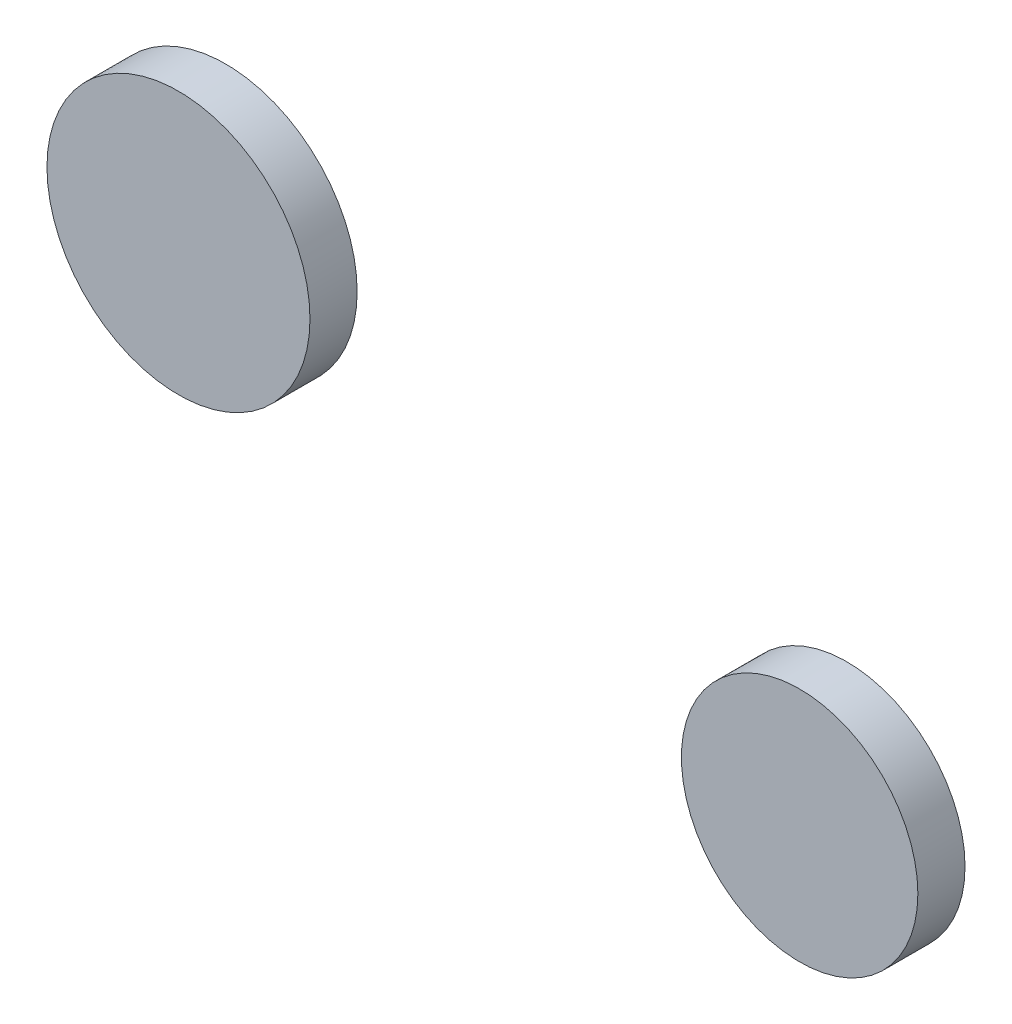
ISO-10303-21;
HEADER;
FILE_DESCRIPTION(('STEP AP214'),'2;1');
FILE_NAME('part.step','',(''),(''),'','','');
FILE_SCHEMA(('AUTOMOTIVE_DESIGN { 1 0 10303 214 1 1 1 1 }'));
ENDSEC;
DATA;
#1=APPLICATION_CONTEXT('core data for automotive mechanical design processes');
#2=APPLICATION_PROTOCOL_DEFINITION('international standard','automotive_design',2000,#1);
#3=PRODUCT_CONTEXT('',#1,'mechanical');
#4=PRODUCT('Part','Part','',(#3));
#5=PRODUCT_RELATED_PRODUCT_CATEGORY('part','',(#4));
#6=PRODUCT_DEFINITION_FORMATION('','',#4);
#7=PRODUCT_DEFINITION_CONTEXT('part definition',#1,'design');
#8=PRODUCT_DEFINITION('design','',#6,#7);
#9=PRODUCT_DEFINITION_SHAPE('','',#8);
#10=(LENGTH_UNIT() NAMED_UNIT(*) SI_UNIT(.MILLI.,.METRE.));
#11=(NAMED_UNIT(*) PLANE_ANGLE_UNIT() SI_UNIT($,.RADIAN.));
#12=(NAMED_UNIT(*) SI_UNIT($,.STERADIAN.) SOLID_ANGLE_UNIT());
#13=UNCERTAINTY_MEASURE_WITH_UNIT(LENGTH_MEASURE(1.E-05),#10,'distance_accuracy_value','');
#14=(GEOMETRIC_REPRESENTATION_CONTEXT(3) GLOBAL_UNCERTAINTY_ASSIGNED_CONTEXT((#13)) GLOBAL_UNIT_ASSIGNED_CONTEXT((#10,
#11,#12)) REPRESENTATION_CONTEXT('',''));
#15=CARTESIAN_POINT('',(0.,0.,0.));
#16=DIRECTION('',(0.,0.,1.));
#17=DIRECTION('',(1.,0.,0.));
#18=AXIS2_PLACEMENT_3D('',#15,#16,#17);
#19=CARTESIAN_POINT('',(-186.065711787609,51.9488183115893,10.));
#20=DIRECTION('',(0.,0.,-1.));
#21=DIRECTION('',(-1.,0.,0.));
#22=AXIS2_PLACEMENT_3D('',#19,#20,#21);
#23=CYLINDRICAL_SURFACE('',#22,27.8829526217616);
#24=CARTESIAN_POINT('',(-186.065711787609,51.9488183115893,10.));
#25=DIRECTION('',(0.,0.,1.));
#26=DIRECTION('',(1.,0.,0.));
#27=AXIS2_PLACEMENT_3D('',#24,#25,#26);
#28=CIRCLE('',#27,27.8829526217616);
#29=CARTESIAN_POINT('',(-158.182759165848,51.9488183115893,10.));
#30=VERTEX_POINT('',#29);
#31=EDGE_CURVE('E11',#30,#30,#28,.T.);
#32=ORIENTED_EDGE('',*,*,#31,.F.);
#33=EDGE_LOOP('',(#32));
#34=FACE_BOUND('',#33,.T.);
#35=CARTESIAN_POINT('',(-186.065711787609,51.9488183115893,0.));
#36=DIRECTION('',(0.,0.,1.));
#37=DIRECTION('',(1.,0.,0.));
#38=AXIS2_PLACEMENT_3D('',#35,#36,#37);
#39=CIRCLE('',#38,27.8829526217616);
#40=CARTESIAN_POINT('',(-158.182759165848,51.9488183115893,0.));
#41=VERTEX_POINT('',#40);
#42=EDGE_CURVE('E50',#41,#41,#39,.T.);
#43=ORIENTED_EDGE('',*,*,#42,.T.);
#44=EDGE_LOOP('',(#43));
#45=FACE_BOUND('',#44,.T.);
#46=ADVANCED_FACE('F47',(#34,#45),#23,.T.);
#47=CARTESIAN_POINT('',(-186.065711787609,51.9488183115893,10.));
#48=DIRECTION('',(0.,0.,1.));
#49=DIRECTION('',(1.,0.,0.));
#50=AXIS2_PLACEMENT_3D('',#47,#48,#49);
#51=PLANE('',#50);
#52=ORIENTED_EDGE('',*,*,#31,.T.);
#53=EDGE_LOOP('',(#52));
#54=FACE_BOUND('',#53,.T.);
#55=ADVANCED_FACE('F64',(#54),#51,.T.);
#56=CARTESIAN_POINT('',(-186.065711787609,51.9488183115893,0.));
#57=DIRECTION('',(0.,0.,1.));
#58=DIRECTION('',(1.,0.,0.));
#59=AXIS2_PLACEMENT_3D('',#56,#57,#58);
#60=PLANE('',#59);
#61=ORIENTED_EDGE('',*,*,#42,.F.);
#62=EDGE_LOOP('',(#61));
#63=FACE_BOUND('',#62,.T.);
#64=ADVANCED_FACE('F62',(#63),#60,.F.);
#65=CLOSED_SHELL('',(#46,#55,#64));
#66=MANIFOLD_SOLID_BREP('B2',#65);
#67=CARTESIAN_POINT('',(-54.3689994844102,10.8470171385153,10.));
#68=DIRECTION('',(0.,0.,-1.));
#69=DIRECTION('',(-1.,0.,0.));
#70=AXIS2_PLACEMENT_3D('',#67,#68,#69);
#71=CYLINDRICAL_SURFACE('',#70,25.0687190592863);
#72=CARTESIAN_POINT('',(-54.3689994844102,10.8470171385153,10.));
#73=DIRECTION('',(0.,0.,1.));
#74=DIRECTION('',(1.,0.,0.));
#75=AXIS2_PLACEMENT_3D('',#72,#73,#74);
#76=CIRCLE('',#75,25.0687190592863);
#77=CARTESIAN_POINT('',(-29.3002804251239,10.8470171385153,10.));
#78=VERTEX_POINT('',#77);
#79=EDGE_CURVE('E46',#78,#78,#76,.T.);
#80=ORIENTED_EDGE('',*,*,#79,.F.);
#81=EDGE_LOOP('',(#80));
#82=FACE_BOUND('',#81,.T.);
#83=CARTESIAN_POINT('',(-54.3689994844102,10.8470171385153,0.));
#84=DIRECTION('',(0.,0.,1.));
#85=DIRECTION('',(1.,0.,0.));
#86=AXIS2_PLACEMENT_3D('',#83,#84,#85);
#87=CIRCLE('',#86,25.0687190592863);
#88=CARTESIAN_POINT('',(-29.3002804251239,10.8470171385153,0.));
#89=VERTEX_POINT('',#88);
#90=EDGE_CURVE('E95',#89,#89,#87,.T.);
#91=ORIENTED_EDGE('',*,*,#90,.T.);
#92=EDGE_LOOP('',(#91));
#93=FACE_BOUND('',#92,.T.);
#94=ADVANCED_FACE('F92',(#82,#93),#71,.T.);
#95=CARTESIAN_POINT('',(-54.3689994844102,10.8470171385153,10.));
#96=DIRECTION('',(0.,0.,1.));
#97=DIRECTION('',(1.,0.,0.));
#98=AXIS2_PLACEMENT_3D('',#95,#96,#97);
#99=PLANE('',#98);
#100=ORIENTED_EDGE('',*,*,#79,.T.);
#101=EDGE_LOOP('',(#100));
#102=FACE_BOUND('',#101,.T.);
#103=ADVANCED_FACE('F107',(#102),#99,.T.);
#104=CARTESIAN_POINT('',(-54.3689994844102,10.8470171385153,0.));
#105=DIRECTION('',(0.,0.,1.));
#106=DIRECTION('',(1.,0.,0.));
#107=AXIS2_PLACEMENT_3D('',#104,#105,#106);
#108=PLANE('',#107);
#109=ORIENTED_EDGE('',*,*,#90,.F.);
#110=EDGE_LOOP('',(#109));
#111=FACE_BOUND('',#110,.T.);
#112=ADVANCED_FACE('F105',(#111),#108,.F.);
#113=CLOSED_SHELL('',(#94,#103,#112));
#114=MANIFOLD_SOLID_BREP('B6',#113);
#115=ADVANCED_BREP_SHAPE_REPRESENTATION('',(#18,#66,#114),#14);
#116=SHAPE_DEFINITION_REPRESENTATION(#9,#115);
ENDSEC;
END-ISO-10303-21;
